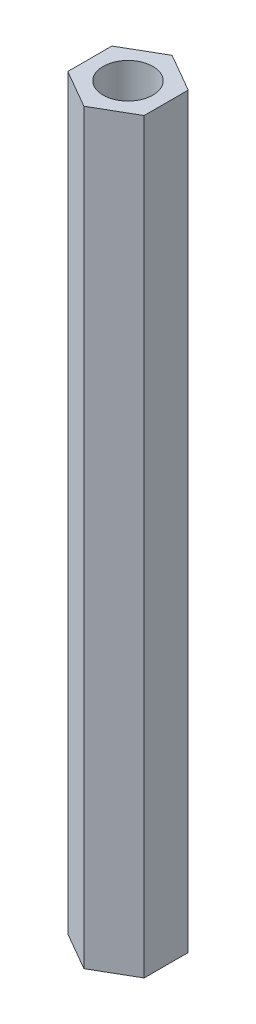
ISO-10303-21;
HEADER;
FILE_DESCRIPTION(('STEP AP214'),'2;1');
FILE_NAME('part.step','',(''),(''),'','','');
FILE_SCHEMA(('AUTOMOTIVE_DESIGN { 1 0 10303 214 1 1 1 1 }'));
ENDSEC;
DATA;
#1=APPLICATION_CONTEXT('core data for automotive mechanical design processes');
#2=APPLICATION_PROTOCOL_DEFINITION('international standard','automotive_design',2000,#1);
#3=PRODUCT_CONTEXT('',#1,'mechanical');
#4=PRODUCT('Part','Part','',(#3));
#5=PRODUCT_RELATED_PRODUCT_CATEGORY('part','',(#4));
#6=PRODUCT_DEFINITION_FORMATION('','',#4);
#7=PRODUCT_DEFINITION_CONTEXT('part definition',#1,'design');
#8=PRODUCT_DEFINITION('design','',#6,#7);
#9=PRODUCT_DEFINITION_SHAPE('','',#8);
#10=(LENGTH_UNIT() NAMED_UNIT(*) SI_UNIT(.MILLI.,.METRE.));
#11=(NAMED_UNIT(*) PLANE_ANGLE_UNIT() SI_UNIT($,.RADIAN.));
#12=(NAMED_UNIT(*) SI_UNIT($,.STERADIAN.) SOLID_ANGLE_UNIT());
#13=UNCERTAINTY_MEASURE_WITH_UNIT(LENGTH_MEASURE(1.E-05),#10,'distance_accuracy_value','');
#14=(GEOMETRIC_REPRESENTATION_CONTEXT(3) GLOBAL_UNCERTAINTY_ASSIGNED_CONTEXT((#13)) GLOBAL_UNIT_ASSIGNED_CONTEXT((#10,
#11,#12)) REPRESENTATION_CONTEXT('',''));
#15=CARTESIAN_POINT('',(0.,0.,0.));
#16=DIRECTION('',(0.,0.,1.));
#17=DIRECTION('',(1.,0.,0.));
#18=AXIS2_PLACEMENT_3D('',#15,#16,#17);
#19=CARTESIAN_POINT('',(0.,45.,0.));
#20=DIRECTION('',(0.,1.,0.));
#21=DIRECTION('',(0.,0.,1.));
#22=AXIS2_PLACEMENT_3D('',#19,#20,#21);
#23=PLANE('',#22);
#24=DIRECTION('',(-0.866025403784442,0.,-0.499999999999995));
#25=VECTOR('',#24,1.);
#26=CARTESIAN_POINT('',(2.29999999999999,45.,-1.32790561913617));
#27=LINE('',#26,#25);
#28=CARTESIAN_POINT('',(2.29999999999999,45.,-1.32790561913617));
#29=VERTEX_POINT('',#28);
#30=CARTESIAN_POINT('',(0.,45.,-2.65581123827228));
#31=VERTEX_POINT('',#30);
#32=EDGE_CURVE('E135',#29,#31,#27,.T.);
#33=ORIENTED_EDGE('',*,*,#32,.T.);
#34=DIRECTION('',(-0.866025403784438,0.,0.500000000000001));
#35=VECTOR('',#34,1.);
#36=CARTESIAN_POINT('',(0.,45.,-2.65581123827228));
#37=LINE('',#36,#35);
#38=CARTESIAN_POINT('',(-2.3,45.,-1.32790561913613));
#39=VERTEX_POINT('',#38);
#40=EDGE_CURVE('E93',#31,#39,#37,.T.);
#41=ORIENTED_EDGE('',*,*,#40,.T.);
#42=DIRECTION('',(0.,0.,1.));
#43=VECTOR('',#42,1.);
#44=CARTESIAN_POINT('',(-2.3,45.,-1.32790561913613));
#45=LINE('',#44,#43);
#46=CARTESIAN_POINT('',(-2.3,45.,1.32790561913615));
#47=VERTEX_POINT('',#46);
#48=EDGE_CURVE('E106',#39,#47,#45,.T.);
#49=ORIENTED_EDGE('',*,*,#48,.T.);
#50=DIRECTION('',(0.866025403784442,0.,0.499999999999995));
#51=VECTOR('',#50,1.);
#52=CARTESIAN_POINT('',(-2.3,45.,1.32790561913615));
#53=LINE('',#52,#51);
#54=CARTESIAN_POINT('',(0.,45.,2.65581123827228));
#55=VERTEX_POINT('',#54);
#56=EDGE_CURVE('E100',#47,#55,#53,.T.);
#57=ORIENTED_EDGE('',*,*,#56,.T.);
#58=DIRECTION('',(0.866025403784435,0.,-0.500000000000007));
#59=VECTOR('',#58,1.);
#60=CARTESIAN_POINT('',(0.,45.,2.65581123827228));
#61=LINE('',#60,#59);
#62=CARTESIAN_POINT('',(2.30000000000001,45.,1.32790561913612));
#63=VERTEX_POINT('',#62);
#64=EDGE_CURVE('E104',#55,#63,#61,.T.);
#65=ORIENTED_EDGE('',*,*,#64,.T.);
#66=DIRECTION('',(0.,0.,-1.));
#67=VECTOR('',#66,1.);
#68=CARTESIAN_POINT('',(2.30000000000001,45.,1.32790561913612));
#69=LINE('',#68,#67);
#70=EDGE_CURVE('E56',#63,#29,#69,.T.);
#71=ORIENTED_EDGE('',*,*,#70,.T.);
#72=EDGE_LOOP('',(#33,#41,#49,#57,#65,#71));
#73=FACE_BOUND('',#72,.T.);
#74=CARTESIAN_POINT('',(0.,45.,0.));
#75=DIRECTION('',(0.,1.,0.));
#76=DIRECTION('',(0.,0.,1.));
#77=AXIS2_PLACEMENT_3D('',#74,#75,#76);
#78=CIRCLE('',#77,1.5);
#79=CARTESIAN_POINT('',(0.,45.,-1.5));
#80=VERTEX_POINT('',#79);
#81=EDGE_CURVE('E128',#80,#80,#78,.T.);
#82=ORIENTED_EDGE('',*,*,#81,.F.);
#83=EDGE_LOOP('',(#82));
#84=FACE_BOUND('',#83,.T.);
#85=ADVANCED_FACE('F39',(#73,#84),#23,.T.);
#86=CARTESIAN_POINT('',(0.,0.,0.));
#87=DIRECTION('',(0.,1.,0.));
#88=DIRECTION('',(0.,0.,1.));
#89=AXIS2_PLACEMENT_3D('',#86,#87,#88);
#90=PLANE('',#89);
#91=DIRECTION('',(-0.866025403784442,0.,-0.499999999999995));
#92=VECTOR('',#91,1.);
#93=CARTESIAN_POINT('',(2.29999999999999,0.,-1.32790561913617));
#94=LINE('',#93,#92);
#95=CARTESIAN_POINT('',(2.29999999999999,0.,-1.32790561913617));
#96=VERTEX_POINT('',#95);
#97=CARTESIAN_POINT('',(0.,0.,-2.65581123827228));
#98=VERTEX_POINT('',#97);
#99=EDGE_CURVE('E124',#96,#98,#94,.T.);
#100=ORIENTED_EDGE('',*,*,#99,.F.);
#101=DIRECTION('',(0.,0.,-1.));
#102=VECTOR('',#101,1.);
#103=CARTESIAN_POINT('',(2.30000000000001,0.,1.32790561913612));
#104=LINE('',#103,#102);
#105=CARTESIAN_POINT('',(2.30000000000001,0.,1.32790561913612));
#106=VERTEX_POINT('',#105);
#107=EDGE_CURVE('E85',#106,#96,#104,.T.);
#108=ORIENTED_EDGE('',*,*,#107,.F.);
#109=DIRECTION('',(0.866025403784435,0.,-0.500000000000007));
#110=VECTOR('',#109,1.);
#111=CARTESIAN_POINT('',(0.,0.,2.65581123827228));
#112=LINE('',#111,#110);
#113=CARTESIAN_POINT('',(0.,0.,2.65581123827228));
#114=VERTEX_POINT('',#113);
#115=EDGE_CURVE('E79',#114,#106,#112,.T.);
#116=ORIENTED_EDGE('',*,*,#115,.F.);
#117=DIRECTION('',(0.866025403784442,0.,0.499999999999995));
#118=VECTOR('',#117,1.);
#119=CARTESIAN_POINT('',(-2.3,0.,1.32790561913615));
#120=LINE('',#119,#118);
#121=CARTESIAN_POINT('',(-2.3,0.,1.32790561913615));
#122=VERTEX_POINT('',#121);
#123=EDGE_CURVE('E114',#122,#114,#120,.T.);
#124=ORIENTED_EDGE('',*,*,#123,.F.);
#125=DIRECTION('',(0.,0.,1.));
#126=VECTOR('',#125,1.);
#127=CARTESIAN_POINT('',(-2.3,0.,-1.32790561913613));
#128=LINE('',#127,#126);
#129=CARTESIAN_POINT('',(-2.3,0.,-1.32790561913613));
#130=VERTEX_POINT('',#129);
#131=EDGE_CURVE('E130',#130,#122,#128,.T.);
#132=ORIENTED_EDGE('',*,*,#131,.F.);
#133=DIRECTION('',(-0.866025403784438,0.,0.500000000000001));
#134=VECTOR('',#133,1.);
#135=CARTESIAN_POINT('',(0.,0.,-2.65581123827228));
#136=LINE('',#135,#134);
#137=EDGE_CURVE('E127',#98,#130,#136,.T.);
#138=ORIENTED_EDGE('',*,*,#137,.F.);
#139=EDGE_LOOP('',(#100,#108,#116,#124,#132,#138));
#140=FACE_BOUND('',#139,.T.);
#141=CARTESIAN_POINT('',(0.,0.,0.));
#142=DIRECTION('',(0.,1.,0.));
#143=DIRECTION('',(0.,0.,1.));
#144=AXIS2_PLACEMENT_3D('',#141,#142,#143);
#145=CIRCLE('',#144,1.5);
#146=CARTESIAN_POINT('',(0.,0.,-1.5));
#147=VERTEX_POINT('',#146);
#148=EDGE_CURVE('E246',#147,#147,#145,.T.);
#149=ORIENTED_EDGE('',*,*,#148,.T.);
#150=EDGE_LOOP('',(#149));
#151=FACE_BOUND('',#150,.T.);
#152=ADVANCED_FACE('F144',(#140,#151),#90,.F.);
#153=CARTESIAN_POINT('',(2.29999999999999,45.,-1.32790561913617));
#154=DIRECTION('',(-0.499999999999995,0.,0.866025403784442));
#155=DIRECTION('',(0.866025403784442,0.,0.499999999999995));
#156=AXIS2_PLACEMENT_3D('',#153,#154,#155);
#157=PLANE('',#156);
#158=ORIENTED_EDGE('',*,*,#99,.T.);
#159=DIRECTION('',(0.,-1.,0.));
#160=VECTOR('',#159,1.);
#161=CARTESIAN_POINT('',(0.,45.,-2.65581123827228));
#162=LINE('',#161,#160);
#163=EDGE_CURVE('E11',#31,#98,#162,.T.);
#164=ORIENTED_EDGE('',*,*,#163,.F.);
#165=ORIENTED_EDGE('',*,*,#32,.F.);
#166=DIRECTION('',(0.,-1.,0.));
#167=VECTOR('',#166,1.);
#168=CARTESIAN_POINT('',(2.29999999999999,45.,-1.32790561913617));
#169=LINE('',#168,#167);
#170=EDGE_CURVE('E120',#29,#96,#169,.T.);
#171=ORIENTED_EDGE('',*,*,#170,.T.);
#172=EDGE_LOOP('',(#158,#164,#165,#171));
#173=FACE_BOUND('',#172,.T.);
#174=ADVANCED_FACE('F41',(#173),#157,.F.);
#175=CARTESIAN_POINT('',(0.,45.,-2.65581123827228));
#176=DIRECTION('',(0.500000000000001,0.,0.866025403784438));
#177=DIRECTION('',(0.866025403784438,0.,-0.500000000000001));
#178=AXIS2_PLACEMENT_3D('',#175,#176,#177);
#179=PLANE('',#178);
#180=ORIENTED_EDGE('',*,*,#137,.T.);
#181=DIRECTION('',(0.,-1.,0.));
#182=VECTOR('',#181,1.);
#183=CARTESIAN_POINT('',(-2.3,45.,-1.32790561913613));
#184=LINE('',#183,#182);
#185=EDGE_CURVE('E48',#39,#130,#184,.T.);
#186=ORIENTED_EDGE('',*,*,#185,.F.);
#187=ORIENTED_EDGE('',*,*,#40,.F.);
#188=ORIENTED_EDGE('',*,*,#163,.T.);
#189=EDGE_LOOP('',(#180,#186,#187,#188));
#190=FACE_BOUND('',#189,.T.);
#191=ADVANCED_FACE('F169',(#190),#179,.F.);
#192=CARTESIAN_POINT('',(-2.3,45.,-1.32790561913613));
#193=DIRECTION('',(1.,0.,0.));
#194=DIRECTION('',(0.,0.,-1.));
#195=AXIS2_PLACEMENT_3D('',#192,#193,#194);
#196=PLANE('',#195);
#197=ORIENTED_EDGE('',*,*,#131,.T.);
#198=DIRECTION('',(0.,-1.,0.));
#199=VECTOR('',#198,1.);
#200=CARTESIAN_POINT('',(-2.3,45.,1.32790561913615));
#201=LINE('',#200,#199);
#202=EDGE_CURVE('E115',#47,#122,#201,.T.);
#203=ORIENTED_EDGE('',*,*,#202,.F.);
#204=ORIENTED_EDGE('',*,*,#48,.F.);
#205=ORIENTED_EDGE('',*,*,#185,.T.);
#206=EDGE_LOOP('',(#197,#203,#204,#205));
#207=FACE_BOUND('',#206,.T.);
#208=ADVANCED_FACE('F141',(#207),#196,.F.);
#209=CARTESIAN_POINT('',(-2.3,45.,1.32790561913615));
#210=DIRECTION('',(0.499999999999995,0.,-0.866025403784442));
#211=DIRECTION('',(-0.866025403784442,0.,-0.499999999999995));
#212=AXIS2_PLACEMENT_3D('',#209,#210,#211);
#213=PLANE('',#212);
#214=ORIENTED_EDGE('',*,*,#123,.T.);
#215=DIRECTION('',(0.,-1.,0.));
#216=VECTOR('',#215,1.);
#217=CARTESIAN_POINT('',(0.,45.,2.65581123827228));
#218=LINE('',#217,#216);
#219=EDGE_CURVE('E111',#55,#114,#218,.T.);
#220=ORIENTED_EDGE('',*,*,#219,.F.);
#221=ORIENTED_EDGE('',*,*,#56,.F.);
#222=ORIENTED_EDGE('',*,*,#202,.T.);
#223=EDGE_LOOP('',(#214,#220,#221,#222));
#224=FACE_BOUND('',#223,.T.);
#225=ADVANCED_FACE('F112',(#224),#213,.F.);
#226=CARTESIAN_POINT('',(0.,45.,2.65581123827228));
#227=DIRECTION('',(-0.500000000000007,0.,-0.866025403784434));
#228=DIRECTION('',(-0.866025403784435,0.,0.500000000000007));
#229=AXIS2_PLACEMENT_3D('',#226,#227,#228);
#230=PLANE('',#229);
#231=ORIENTED_EDGE('',*,*,#115,.T.);
#232=DIRECTION('',(0.,-1.,0.));
#233=VECTOR('',#232,1.);
#234=CARTESIAN_POINT('',(2.30000000000001,45.,1.32790561913612));
#235=LINE('',#234,#233);
#236=EDGE_CURVE('E116',#63,#106,#235,.T.);
#237=ORIENTED_EDGE('',*,*,#236,.F.);
#238=ORIENTED_EDGE('',*,*,#64,.F.);
#239=ORIENTED_EDGE('',*,*,#219,.T.);
#240=EDGE_LOOP('',(#231,#237,#238,#239));
#241=FACE_BOUND('',#240,.T.);
#242=ADVANCED_FACE('F118',(#241),#230,.F.);
#243=CARTESIAN_POINT('',(2.30000000000001,45.,1.32790561913612));
#244=DIRECTION('',(-1.,0.,0.));
#245=DIRECTION('',(0.,0.,1.));
#246=AXIS2_PLACEMENT_3D('',#243,#244,#245);
#247=PLANE('',#246);
#248=ORIENTED_EDGE('',*,*,#107,.T.);
#249=ORIENTED_EDGE('',*,*,#170,.F.);
#250=ORIENTED_EDGE('',*,*,#70,.F.);
#251=ORIENTED_EDGE('',*,*,#236,.T.);
#252=EDGE_LOOP('',(#248,#249,#250,#251));
#253=FACE_BOUND('',#252,.T.);
#254=ADVANCED_FACE('F149',(#253),#247,.F.);
#255=CARTESIAN_POINT('',(0.,45.,0.));
#256=DIRECTION('',(0.,-1.,0.));
#257=DIRECTION('',(0.,0.,-1.));
#258=AXIS2_PLACEMENT_3D('',#255,#256,#257);
#259=CYLINDRICAL_SURFACE('',#258,1.5);
#260=CARTESIAN_POINT('',(0.,45.,-1.5));
#261=CARTESIAN_POINT('',(0.,44.53125,-1.5));
#262=CARTESIAN_POINT('',(0.,44.0625,-1.5));
#263=CARTESIAN_POINT('',(0.,43.125,-1.5));
#264=CARTESIAN_POINT('',(0.,42.65625,-1.5));
#265=CARTESIAN_POINT('',(0.,41.71875,-1.5));
#266=CARTESIAN_POINT('',(0.,41.25,-1.5));
#267=CARTESIAN_POINT('',(0.,40.3125,-1.5));
#268=CARTESIAN_POINT('',(0.,39.84375,-1.5));
#269=CARTESIAN_POINT('',(0.,38.90625,-1.5));
#270=CARTESIAN_POINT('',(0.,38.4375,-1.5));
#271=CARTESIAN_POINT('',(0.,37.5,-1.5));
#272=CARTESIAN_POINT('',(0.,37.03125,-1.5));
#273=CARTESIAN_POINT('',(0.,36.09375,-1.5));
#274=CARTESIAN_POINT('',(0.,35.625,-1.5));
#275=CARTESIAN_POINT('',(0.,34.6875,-1.5));
#276=CARTESIAN_POINT('',(0.,34.21875,-1.5));
#277=CARTESIAN_POINT('',(0.,33.28125,-1.5));
#278=CARTESIAN_POINT('',(0.,32.8125,-1.5));
#279=CARTESIAN_POINT('',(0.,31.875,-1.5));
#280=CARTESIAN_POINT('',(0.,31.40625,-1.5));
#281=CARTESIAN_POINT('',(0.,30.46875,-1.5));
#282=CARTESIAN_POINT('',(0.,30.,-1.5));
#283=CARTESIAN_POINT('',(0.,29.0625,-1.5));
#284=CARTESIAN_POINT('',(0.,28.59375,-1.5));
#285=CARTESIAN_POINT('',(0.,27.65625,-1.5));
#286=CARTESIAN_POINT('',(0.,27.1875,-1.5));
#287=CARTESIAN_POINT('',(0.,26.25,-1.5));
#288=CARTESIAN_POINT('',(0.,25.78125,-1.5));
#289=CARTESIAN_POINT('',(0.,24.84375,-1.5));
#290=CARTESIAN_POINT('',(0.,24.375,-1.5));
#291=CARTESIAN_POINT('',(0.,23.4375,-1.5));
#292=CARTESIAN_POINT('',(0.,22.96875,-1.5));
#293=CARTESIAN_POINT('',(0.,22.03125,-1.5));
#294=CARTESIAN_POINT('',(0.,21.5625,-1.5));
#295=CARTESIAN_POINT('',(0.,20.625,-1.5));
#296=CARTESIAN_POINT('',(0.,20.15625,-1.5));
#297=CARTESIAN_POINT('',(0.,19.21875,-1.5));
#298=CARTESIAN_POINT('',(0.,18.75,-1.5));
#299=CARTESIAN_POINT('',(0.,17.8125,-1.5));
#300=CARTESIAN_POINT('',(0.,17.34375,-1.5));
#301=CARTESIAN_POINT('',(0.,16.40625,-1.5));
#302=CARTESIAN_POINT('',(0.,15.9375,-1.5));
#303=CARTESIAN_POINT('',(0.,15.,-1.5));
#304=CARTESIAN_POINT('',(0.,14.53125,-1.5));
#305=CARTESIAN_POINT('',(0.,13.59375,-1.5));
#306=CARTESIAN_POINT('',(0.,13.125,-1.5));
#307=CARTESIAN_POINT('',(0.,12.1875,-1.5));
#308=CARTESIAN_POINT('',(0.,11.71875,-1.5));
#309=CARTESIAN_POINT('',(0.,10.78125,-1.5));
#310=CARTESIAN_POINT('',(0.,10.3125,-1.5));
#311=CARTESIAN_POINT('',(0.,9.37499999999999,-1.5));
#312=CARTESIAN_POINT('',(0.,8.90624999999999,-1.5));
#313=CARTESIAN_POINT('',(0.,7.96874999999999,-1.5));
#314=CARTESIAN_POINT('',(0.,7.5,-1.5));
#315=CARTESIAN_POINT('',(0.,6.56249999999999,-1.5));
#316=CARTESIAN_POINT('',(0.,6.09374999999999,-1.5));
#317=CARTESIAN_POINT('',(0.,5.15624999999999,-1.5));
#318=CARTESIAN_POINT('',(0.,4.68749999999999,-1.5));
#319=CARTESIAN_POINT('',(0.,3.74999999999999,-1.5));
#320=CARTESIAN_POINT('',(0.,3.28124999999999,-1.5));
#321=CARTESIAN_POINT('',(0.,2.34374999999999,-1.5));
#322=CARTESIAN_POINT('',(0.,1.87499999999999,-1.5));
#323=CARTESIAN_POINT('',(0.,0.937499999999992,-1.5));
#324=CARTESIAN_POINT('',(0.,0.468749999999993,-1.5));
#325=CARTESIAN_POINT('',(0.,0.,-1.5));
#326=B_SPLINE_CURVE_WITH_KNOTS('',3,(#260,#261,#262,#263,#264,#265,#266,#267,#268,#269,#270,
#271,#272,#273,#274,#275,#276,#277,#278,#279,#280,#281,#282,#283,#284,#285,#286,#287,#288,#289,
#290,#291,#292,#293,#294,#295,#296,#297,#298,#299,#300,#301,#302,#303,#304,#305,#306,#307,#308,
#309,#310,#311,#312,#313,#314,#315,#316,#317,#318,#319,#320,#321,#322,#323,#324,#325),
.UNSPECIFIED.,.F.,.F.,(4,2,2,2,2,2,2,2,2,2,2,2,2,2,2,2,2,2,2,2,2,2,2,2,2,2,2,2,2,2,2,2,4),(0.,
1.40625,2.8125,4.21874999999999,5.625,7.03125,8.43749999999999,9.84375,11.25,12.65625,14.0625,
15.46875,16.875,18.28125,19.6875,21.09375,22.5,23.90625,25.3125,26.71875,28.125,29.53125,
30.9375,32.34375,33.75,35.15625,36.5625,37.96875,39.375,40.78125,42.1875,43.59375,45.),.UNSPECIFIED.);
#327=EDGE_CURVE('BSEAM151',#80,#147,#326,.T.);
#328=ORIENTED_EDGE('',*,*,#81,.T.);
#329=ORIENTED_EDGE('',*,*,#148,.F.);
#330=ORIENTED_EDGE('',*,*,#327,.T.);
#331=ORIENTED_EDGE('',*,*,#327,.F.);
#332=EDGE_LOOP('',(#328,#330,#329,#331));
#333=FACE_BOUND('',#332,.T.);
#334=ADVANCED_FACE('F151',(#333),#259,.F.);
#335=CLOSED_SHELL('',(#85,#152,#174,#191,#208,#225,#242,#254,#334));
#336=MANIFOLD_SOLID_BREP('B2',#335);
#337=ADVANCED_BREP_SHAPE_REPRESENTATION('',(#18,#336),#14);
#338=SHAPE_DEFINITION_REPRESENTATION(#9,#337);
ENDSEC;
END-ISO-10303-21;
